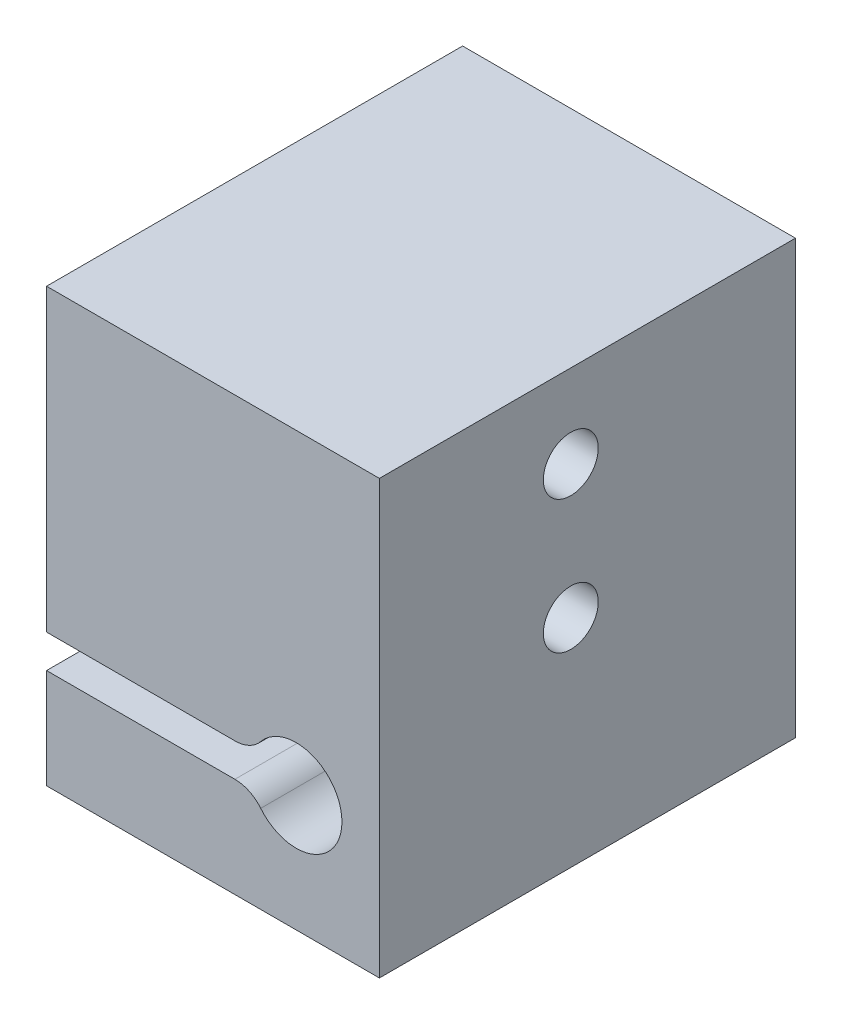
ISO-10303-21;
HEADER;
FILE_DESCRIPTION(('STEP AP214'),'2;1');
FILE_NAME('part.step','',(''),(''),'','','');
FILE_SCHEMA(('AUTOMOTIVE_DESIGN { 1 0 10303 214 1 1 1 1 }'));
ENDSEC;
DATA;
#1=APPLICATION_CONTEXT('core data for automotive mechanical design processes');
#2=APPLICATION_PROTOCOL_DEFINITION('international standard','automotive_design',2000,#1);
#3=PRODUCT_CONTEXT('',#1,'mechanical');
#4=PRODUCT('Part','Part','',(#3));
#5=PRODUCT_RELATED_PRODUCT_CATEGORY('part','',(#4));
#6=PRODUCT_DEFINITION_FORMATION('','',#4);
#7=PRODUCT_DEFINITION_CONTEXT('part definition',#1,'design');
#8=PRODUCT_DEFINITION('design','',#6,#7);
#9=PRODUCT_DEFINITION_SHAPE('','',#8);
#10=(LENGTH_UNIT() NAMED_UNIT(*) SI_UNIT(.MILLI.,.METRE.));
#11=(NAMED_UNIT(*) PLANE_ANGLE_UNIT() SI_UNIT($,.RADIAN.));
#12=(NAMED_UNIT(*) SI_UNIT($,.STERADIAN.) SOLID_ANGLE_UNIT());
#13=UNCERTAINTY_MEASURE_WITH_UNIT(LENGTH_MEASURE(1.E-05),#10,'distance_accuracy_value','');
#14=(GEOMETRIC_REPRESENTATION_CONTEXT(3) GLOBAL_UNCERTAINTY_ASSIGNED_CONTEXT((#13)) GLOBAL_UNIT_ASSIGNED_CONTEXT((#10,
#11,#12)) REPRESENTATION_CONTEXT('',''));
#15=CARTESIAN_POINT('',(0.,0.,0.));
#16=DIRECTION('',(0.,0.,1.));
#17=DIRECTION('',(1.,0.,0.));
#18=AXIS2_PLACEMENT_3D('',#15,#16,#17);
#19=CARTESIAN_POINT('',(10.,12.5,0.));
#20=DIRECTION('',(0.,0.,1.));
#21=DIRECTION('',(1.,0.,0.));
#22=AXIS2_PLACEMENT_3D('',#19,#20,#21);
#23=PLANE('',#22);
#24=CARTESIAN_POINT('',(15.0000002235174,7.00000010430813,0.));
#25=DIRECTION('',(0.,0.,1.));
#26=DIRECTION('',(1.,0.,0.));
#27=AXIS2_PLACEMENT_3D('',#24,#25,#26);
#28=CIRCLE('',#27,1.25);
#29=CARTESIAN_POINT('',(13.7500002235174,7.00000010430813,0.));
#30=VERTEX_POINT('',#29);
#31=EDGE_CURVE('E211',#30,#30,#28,.T.);
#32=ORIENTED_EDGE('',*,*,#31,.T.);
#33=EDGE_LOOP('',(#32));
#34=FACE_BOUND('',#33,.T.);
#35=DIRECTION('',(0.,-1.,0.));
#36=VECTOR('',#35,1.);
#37=CARTESIAN_POINT('',(0.,25.,0.));
#38=LINE('',#37,#36);
#39=CARTESIAN_POINT('',(0.,26.,0.));
#40=VERTEX_POINT('',#39);
#41=CARTESIAN_POINT('',(0.,0.,0.));
#42=VERTEX_POINT('',#41);
#43=EDGE_CURVE('E10',#40,#42,#38,.T.);
#44=ORIENTED_EDGE('',*,*,#43,.F.);
#45=DIRECTION('',(-1.,0.,0.));
#46=VECTOR('',#45,1.);
#47=CARTESIAN_POINT('',(20.,26.,0.));
#48=LINE('',#47,#46);
#49=CARTESIAN_POINT('',(20.,26.,0.));
#50=VERTEX_POINT('',#49);
#51=EDGE_CURVE('E199',#50,#40,#48,.T.);
#52=ORIENTED_EDGE('',*,*,#51,.F.);
#53=DIRECTION('',(0.,1.,0.));
#54=VECTOR('',#53,1.);
#55=CARTESIAN_POINT('',(20.,0.,0.));
#56=LINE('',#55,#54);
#57=CARTESIAN_POINT('',(20.,0.,0.));
#58=VERTEX_POINT('',#57);
#59=EDGE_CURVE('E236',#58,#50,#56,.T.);
#60=ORIENTED_EDGE('',*,*,#59,.F.);
#61=DIRECTION('',(1.,0.,0.));
#62=VECTOR('',#61,1.);
#63=CARTESIAN_POINT('',(0.,0.,0.));
#64=LINE('',#63,#62);
#65=EDGE_CURVE('E235',#42,#58,#64,.T.);
#66=ORIENTED_EDGE('',*,*,#65,.F.);
#67=EDGE_LOOP('',(#44,#52,#60,#66));
#68=FACE_BOUND('',#67,.T.);
#69=ADVANCED_FACE('F16',(#34,#68),#23,.F.);
#70=CARTESIAN_POINT('',(0.,25.,0.));
#71=DIRECTION('',(-1.,0.,0.));
#72=DIRECTION('',(0.,0.,1.));
#73=AXIS2_PLACEMENT_3D('',#70,#71,#72);
#74=PLANE('',#73);
#75=CARTESIAN_POINT('',(0.,21.,13.5));
#76=DIRECTION('',(1.,0.,0.));
#77=DIRECTION('',(0.,-1.,0.));
#78=AXIS2_PLACEMENT_3D('',#75,#76,#77);
#79=CIRCLE('',#78,1.65);
#80=CARTESIAN_POINT('',(0.,22.65,13.5));
#81=VERTEX_POINT('',#80);
#82=EDGE_CURVE('E227',#81,#81,#79,.T.);
#83=ORIENTED_EDGE('',*,*,#82,.T.);
#84=EDGE_LOOP('',(#83));
#85=FACE_BOUND('',#84,.T.);
#86=CARTESIAN_POINT('',(0.,13.0000001192093,13.5));
#87=DIRECTION('',(1.,0.,0.));
#88=DIRECTION('',(0.,-1.,0.));
#89=AXIS2_PLACEMENT_3D('',#86,#87,#88);
#90=CIRCLE('',#89,1.65);
#91=CARTESIAN_POINT('',(0.,14.6500001192093,13.5));
#92=VERTEX_POINT('',#91);
#93=EDGE_CURVE('E273',#92,#92,#90,.T.);
#94=ORIENTED_EDGE('',*,*,#93,.T.);
#95=EDGE_LOOP('',(#94));
#96=FACE_BOUND('',#95,.T.);
#97=DIRECTION('',(0.,0.,1.));
#98=VECTOR('',#97,1.);
#99=CARTESIAN_POINT('',(0.,8.00000011920929,12.5));
#100=LINE('',#99,#98);
#101=CARTESIAN_POINT('',(0.,8.00000011920929,9.5));
#102=VERTEX_POINT('',#101);
#103=CARTESIAN_POINT('',(0.,8.00000011920929,25.));
#104=VERTEX_POINT('',#103);
#105=EDGE_CURVE('E20',#102,#104,#100,.T.);
#106=ORIENTED_EDGE('',*,*,#105,.T.);
#107=DIRECTION('',(0.,1.,0.));
#108=VECTOR('',#107,1.);
#109=CARTESIAN_POINT('',(0.,25.,25.));
#110=LINE('',#109,#108);
#111=CARTESIAN_POINT('',(0.,26.,25.));
#112=VERTEX_POINT('',#111);
#113=EDGE_CURVE('E208',#104,#112,#110,.T.);
#114=ORIENTED_EDGE('',*,*,#113,.T.);
#115=DIRECTION('',(0.,0.,1.));
#116=VECTOR('',#115,1.);
#117=CARTESIAN_POINT('',(0.,26.,0.));
#118=LINE('',#117,#116);
#119=EDGE_CURVE('E196',#40,#112,#118,.T.);
#120=ORIENTED_EDGE('',*,*,#119,.F.);
#121=ORIENTED_EDGE('',*,*,#43,.T.);
#122=DIRECTION('',(0.,0.,1.));
#123=VECTOR('',#122,1.);
#124=CARTESIAN_POINT('',(0.,0.,0.));
#125=LINE('',#124,#123);
#126=CARTESIAN_POINT('',(0.,0.,25.));
#127=VERTEX_POINT('',#126);
#128=EDGE_CURVE('E27',#42,#127,#125,.T.);
#129=ORIENTED_EDGE('',*,*,#128,.T.);
#130=DIRECTION('',(0.,-1.,0.));
#131=VECTOR('',#130,1.);
#132=CARTESIAN_POINT('',(0.,25.,25.));
#133=LINE('',#132,#131);
#134=CARTESIAN_POINT('',(0.,6.00000008940697,25.));
#135=VERTEX_POINT('',#134);
#136=EDGE_CURVE('E160',#135,#127,#133,.T.);
#137=ORIENTED_EDGE('',*,*,#136,.F.);
#138=DIRECTION('',(0.,0.,-1.));
#139=VECTOR('',#138,1.);
#140=CARTESIAN_POINT('',(0.,6.00000008940697,12.5));
#141=LINE('',#140,#139);
#142=CARTESIAN_POINT('',(0.,6.00000008940697,9.5));
#143=VERTEX_POINT('',#142);
#144=EDGE_CURVE('E154',#135,#143,#141,.T.);
#145=ORIENTED_EDGE('',*,*,#144,.T.);
#146=DIRECTION('',(0.,1.,0.));
#147=VECTOR('',#146,1.);
#148=CARTESIAN_POINT('',(0.,16.0000000521541,9.5));
#149=LINE('',#148,#147);
#150=EDGE_CURVE('E260',#143,#102,#149,.T.);
#151=ORIENTED_EDGE('',*,*,#150,.T.);
#152=EDGE_LOOP('',(#106,#114,#120,#121,#129,#137,#145,#151));
#153=FACE_BOUND('',#152,.T.);
#154=ADVANCED_FACE('F308',(#85,#96,#153),#74,.T.);
#155=CARTESIAN_POINT('',(0.,0.,0.));
#156=DIRECTION('',(0.,-1.,0.));
#157=DIRECTION('',(0.,0.,-1.));
#158=AXIS2_PLACEMENT_3D('',#155,#156,#157);
#159=PLANE('',#158);
#160=ORIENTED_EDGE('',*,*,#65,.T.);
#161=DIRECTION('',(0.,0.,1.));
#162=VECTOR('',#161,1.);
#163=CARTESIAN_POINT('',(20.,0.,0.));
#164=LINE('',#163,#162);
#165=CARTESIAN_POINT('',(20.,0.,25.));
#166=VERTEX_POINT('',#165);
#167=EDGE_CURVE('E232',#58,#166,#164,.T.);
#168=ORIENTED_EDGE('',*,*,#167,.T.);
#169=DIRECTION('',(1.,0.,0.));
#170=VECTOR('',#169,1.);
#171=CARTESIAN_POINT('',(0.,0.,25.));
#172=LINE('',#171,#170);
#173=EDGE_CURVE('E231',#127,#166,#172,.T.);
#174=ORIENTED_EDGE('',*,*,#173,.F.);
#175=ORIENTED_EDGE('',*,*,#128,.F.);
#176=EDGE_LOOP('',(#160,#168,#174,#175));
#177=FACE_BOUND('',#176,.T.);
#178=ADVANCED_FACE('F327',(#177),#159,.T.);
#179=CARTESIAN_POINT('',(20.,0.,0.));
#180=DIRECTION('',(1.,0.,0.));
#181=DIRECTION('',(0.,1.,0.));
#182=AXIS2_PLACEMENT_3D('',#179,#180,#181);
#183=PLANE('',#182);
#184=CARTESIAN_POINT('',(20.,21.,13.5));
#185=DIRECTION('',(-1.,0.,0.));
#186=DIRECTION('',(0.,-1.,0.));
#187=AXIS2_PLACEMENT_3D('',#184,#185,#186);
#188=CIRCLE('',#187,1.65);
#189=CARTESIAN_POINT('',(20.,22.65,13.5));
#190=VERTEX_POINT('',#189);
#191=EDGE_CURVE('E101',#190,#190,#188,.T.);
#192=ORIENTED_EDGE('',*,*,#191,.T.);
#193=EDGE_LOOP('',(#192));
#194=FACE_BOUND('',#193,.T.);
#195=CARTESIAN_POINT('',(20.,13.0000001192093,13.5));
#196=DIRECTION('',(-1.,0.,0.));
#197=DIRECTION('',(0.,-1.,0.));
#198=AXIS2_PLACEMENT_3D('',#195,#196,#197);
#199=CIRCLE('',#198,1.65);
#200=CARTESIAN_POINT('',(20.,14.6500001192093,13.5));
#201=VERTEX_POINT('',#200);
#202=EDGE_CURVE('E191',#201,#201,#199,.T.);
#203=ORIENTED_EDGE('',*,*,#202,.T.);
#204=EDGE_LOOP('',(#203));
#205=FACE_BOUND('',#204,.T.);
#206=ORIENTED_EDGE('',*,*,#59,.T.);
#207=DIRECTION('',(0.,0.,-1.));
#208=VECTOR('',#207,1.);
#209=CARTESIAN_POINT('',(20.,26.,0.));
#210=LINE('',#209,#208);
#211=CARTESIAN_POINT('',(20.,26.,25.));
#212=VERTEX_POINT('',#211);
#213=EDGE_CURVE('E178',#212,#50,#210,.T.);
#214=ORIENTED_EDGE('',*,*,#213,.F.);
#215=DIRECTION('',(0.,1.,0.));
#216=VECTOR('',#215,1.);
#217=CARTESIAN_POINT('',(20.,0.,25.));
#218=LINE('',#217,#216);
#219=EDGE_CURVE('E237',#166,#212,#218,.T.);
#220=ORIENTED_EDGE('',*,*,#219,.F.);
#221=ORIENTED_EDGE('',*,*,#167,.F.);
#222=EDGE_LOOP('',(#206,#214,#220,#221));
#223=FACE_BOUND('',#222,.T.);
#224=ADVANCED_FACE('F324',(#194,#205,#223),#183,.T.);
#225=CARTESIAN_POINT('',(0.,8.00000011920929,25.));
#226=DIRECTION('',(0.,1.,0.));
#227=DIRECTION('',(1.,0.,0.));
#228=AXIS2_PLACEMENT_3D('',#225,#226,#227);
#229=PLANE('',#228);
#230=DIRECTION('',(0.,0.,-1.));
#231=VECTOR('',#230,1.);
#232=CARTESIAN_POINT('',(11.317270269992,8.00000011920929,17.25));
#233=LINE('',#232,#231);
#234=CARTESIAN_POINT('',(11.317270269992,8.00000011920929,25.));
#235=VERTEX_POINT('',#234);
#236=CARTESIAN_POINT('',(11.317270269992,8.00000011920929,9.5));
#237=VERTEX_POINT('',#236);
#238=EDGE_CURVE('E258',#235,#237,#233,.T.);
#239=ORIENTED_EDGE('',*,*,#238,.F.);
#240=DIRECTION('',(1.,0.,0.));
#241=VECTOR('',#240,1.);
#242=CARTESIAN_POINT('',(5.,8.00000011920929,25.));
#243=LINE('',#242,#241);
#244=EDGE_CURVE('E204',#104,#235,#243,.T.);
#245=ORIENTED_EDGE('',*,*,#244,.F.);
#246=ORIENTED_EDGE('',*,*,#105,.F.);
#247=DIRECTION('',(1.,0.,0.));
#248=VECTOR('',#247,1.);
#249=CARTESIAN_POINT('',(15.0000002235174,8.00000011920929,9.5));
#250=LINE('',#249,#248);
#251=EDGE_CURVE('E216',#102,#237,#250,.T.);
#252=ORIENTED_EDGE('',*,*,#251,.T.);
#253=EDGE_LOOP('',(#239,#245,#246,#252));
#254=FACE_BOUND('',#253,.T.);
#255=ADVANCED_FACE('F366',(#254),#229,.F.);
#256=CARTESIAN_POINT('',(7.50000011175871,7.00000010430813,9.5));
#257=DIRECTION('',(0.,0.,-1.));
#258=DIRECTION('',(0.,-1.,0.));
#259=AXIS2_PLACEMENT_3D('',#256,#257,#258);
#260=PLANE('',#259);
#261=CARTESIAN_POINT('',(15.0000002235174,7.00000010430813,9.5));
#262=DIRECTION('',(0.,0.,-1.));
#263=DIRECTION('',(1.,0.,0.));
#264=AXIS2_PLACEMENT_3D('',#261,#262,#263);
#265=CIRCLE('',#264,1.25);
#266=CARTESIAN_POINT('',(13.7500002235174,7.00000010430813,9.5));
#267=VERTEX_POINT('',#266);
#268=EDGE_CURVE('E223',#267,#267,#265,.T.);
#269=ORIENTED_EDGE('',*,*,#268,.T.);
#270=EDGE_LOOP('',(#269));
#271=FACE_BOUND('',#270,.T.);
#272=ORIENTED_EDGE('',*,*,#251,.F.);
#273=ORIENTED_EDGE('',*,*,#150,.F.);
#274=DIRECTION('',(-1.,0.,0.));
#275=VECTOR('',#274,1.);
#276=CARTESIAN_POINT('',(0.,6.00000008940697,9.5));
#277=LINE('',#276,#275);
#278=CARTESIAN_POINT('',(11.317270269992,6.00000008940697,9.5));
#279=VERTEX_POINT('',#278);
#280=EDGE_CURVE('E209',#279,#143,#277,.T.);
#281=ORIENTED_EDGE('',*,*,#280,.F.);
#282=CARTESIAN_POINT('',(11.317270269992,4.00000008940697,9.5));
#283=DIRECTION('',(0.,0.,1.));
#284=DIRECTION('',(0.429197535812179,0.903210648327816,0.));
#285=AXIS2_PLACEMENT_3D('',#282,#283,#284);
#286=CIRCLE('',#285,2.);
#287=CARTESIAN_POINT('',(12.8678934083185,5.26315799041798,9.5));
#288=VERTEX_POINT('',#287);
#289=EDGE_CURVE('E169',#288,#279,#286,.T.);
#290=ORIENTED_EDGE('',*,*,#289,.F.);
#291=CARTESIAN_POINT('',(15.0000002235174,7.00000010430813,9.5));
#292=DIRECTION('',(0.,0.,-1.));
#293=DIRECTION('',(1.,0.,0.));
#294=AXIS2_PLACEMENT_3D('',#291,#292,#293);
#295=CIRCLE('',#294,2.75);
#296=CARTESIAN_POINT('',(12.8678934083185,8.73684221819827,9.5));
#297=VERTEX_POINT('',#296);
#298=EDGE_CURVE('E161',#297,#288,#295,.T.);
#299=ORIENTED_EDGE('',*,*,#298,.F.);
#300=CARTESIAN_POINT('',(11.317270269992,10.0000001192093,9.5));
#301=DIRECTION('',(0.,0.,1.));
#302=DIRECTION('',(0.429197535812178,-0.903210648327816,0.));
#303=AXIS2_PLACEMENT_3D('',#300,#301,#302);
#304=CIRCLE('',#303,2.);
#305=EDGE_CURVE('E277',#237,#297,#304,.T.);
#306=ORIENTED_EDGE('',*,*,#305,.F.);
#307=EDGE_LOOP('',(#272,#273,#281,#290,#299,#306));
#308=FACE_BOUND('',#307,.T.);
#309=ADVANCED_FACE('F251',(#271,#308),#260,.F.);
#310=CARTESIAN_POINT('',(15.0000002235174,6.00000008940697,25.));
#311=DIRECTION('',(0.,-1.,0.));
#312=DIRECTION('',(0.,0.,-1.));
#313=AXIS2_PLACEMENT_3D('',#310,#311,#312);
#314=PLANE('',#313);
#315=DIRECTION('',(0.,0.,1.));
#316=VECTOR('',#315,1.);
#317=CARTESIAN_POINT('',(11.317270269992,6.00000008940697,17.25));
#318=LINE('',#317,#316);
#319=CARTESIAN_POINT('',(11.317270269992,6.00000008940697,25.));
#320=VERTEX_POINT('',#319);
#321=EDGE_CURVE('E151',#279,#320,#318,.T.);
#322=ORIENTED_EDGE('',*,*,#321,.F.);
#323=ORIENTED_EDGE('',*,*,#280,.T.);
#324=ORIENTED_EDGE('',*,*,#144,.F.);
#325=DIRECTION('',(-1.,0.,0.));
#326=VECTOR('',#325,1.);
#327=CARTESIAN_POINT('',(12.5000001117587,6.00000008940697,25.));
#328=LINE('',#327,#326);
#329=EDGE_CURVE('E148',#320,#135,#328,.T.);
#330=ORIENTED_EDGE('',*,*,#329,.F.);
#331=EDGE_LOOP('',(#322,#323,#324,#330));
#332=FACE_BOUND('',#331,.T.);
#333=ADVANCED_FACE('F18',(#332),#314,.F.);
#334=CARTESIAN_POINT('',(15.0000002235174,7.00000010430813,1.75));
#335=DIRECTION('',(0.,0.,-1.));
#336=DIRECTION('',(1.,0.,0.));
#337=AXIS2_PLACEMENT_3D('',#334,#335,#336);
#338=CYLINDRICAL_SURFACE('',#337,1.25);
#339=ORIENTED_EDGE('',*,*,#268,.F.);
#340=DIRECTION('',(0.,0.,-1.));
#341=VECTOR('',#340,1.);
#342=CARTESIAN_POINT('',(13.7500002235174,7.00000010430813,1.75));
#343=LINE('',#342,#341);
#344=EDGE_CURVE('E112',#267,#30,#343,.T.);
#345=ORIENTED_EDGE('',*,*,#344,.T.);
#346=ORIENTED_EDGE('',*,*,#31,.F.);
#347=ORIENTED_EDGE('',*,*,#344,.F.);
#348=EDGE_LOOP('',(#339,#345,#346,#347));
#349=FACE_BOUND('',#348,.T.);
#350=ADVANCED_FACE('F341',(#349),#338,.F.);
#351=CARTESIAN_POINT('',(10.,21.,13.5));
#352=DIRECTION('',(1.,0.,0.));
#353=DIRECTION('',(0.,-1.,0.));
#354=AXIS2_PLACEMENT_3D('',#351,#352,#353);
#355=CYLINDRICAL_SURFACE('',#354,1.65);
#356=ORIENTED_EDGE('',*,*,#82,.F.);
#357=DIRECTION('',(1.,0.,0.));
#358=VECTOR('',#357,1.);
#359=CARTESIAN_POINT('',(10.,22.65,13.5));
#360=LINE('',#359,#358);
#361=EDGE_CURVE('E278',#81,#190,#360,.T.);
#362=ORIENTED_EDGE('',*,*,#361,.T.);
#363=ORIENTED_EDGE('',*,*,#191,.F.);
#364=ORIENTED_EDGE('',*,*,#361,.F.);
#365=EDGE_LOOP('',(#356,#362,#363,#364));
#366=FACE_BOUND('',#365,.T.);
#367=ADVANCED_FACE('F343',(#366),#355,.F.);
#368=CARTESIAN_POINT('',(10.,13.0000001192093,13.5));
#369=DIRECTION('',(1.,0.,0.));
#370=DIRECTION('',(0.,-1.,0.));
#371=AXIS2_PLACEMENT_3D('',#368,#369,#370);
#372=CYLINDRICAL_SURFACE('',#371,1.65);
#373=ORIENTED_EDGE('',*,*,#93,.F.);
#374=DIRECTION('',(1.,0.,0.));
#375=VECTOR('',#374,1.);
#376=CARTESIAN_POINT('',(10.,14.6500001192093,13.5));
#377=LINE('',#376,#375);
#378=EDGE_CURVE('E269',#92,#201,#377,.T.);
#379=ORIENTED_EDGE('',*,*,#378,.T.);
#380=ORIENTED_EDGE('',*,*,#202,.F.);
#381=ORIENTED_EDGE('',*,*,#378,.F.);
#382=EDGE_LOOP('',(#373,#379,#380,#381));
#383=FACE_BOUND('',#382,.T.);
#384=ADVANCED_FACE('F350',(#383),#372,.F.);
#385=CARTESIAN_POINT('',(11.317270269992,10.0000001192093,17.25));
#386=DIRECTION('',(0.,0.,1.));
#387=DIRECTION('',(0.429197535812178,-0.903210648327816,0.));
#388=AXIS2_PLACEMENT_3D('',#385,#386,#387);
#389=CYLINDRICAL_SURFACE('',#388,2.);
#390=CARTESIAN_POINT('',(11.317270269992,10.0000001192093,25.));
#391=DIRECTION('',(0.,0.,-1.));
#392=DIRECTION('',(0.429197535812178,-0.903210648327816,0.));
#393=AXIS2_PLACEMENT_3D('',#390,#391,#392);
#394=CIRCLE('',#393,2.);
#395=CARTESIAN_POINT('',(12.8678934083185,8.73684221819827,25.));
#396=VERTEX_POINT('',#395);
#397=EDGE_CURVE('E207',#396,#235,#394,.T.);
#398=ORIENTED_EDGE('',*,*,#397,.T.);
#399=ORIENTED_EDGE('',*,*,#238,.T.);
#400=ORIENTED_EDGE('',*,*,#305,.T.);
#401=DIRECTION('',(0.,0.,1.));
#402=VECTOR('',#401,1.);
#403=CARTESIAN_POINT('',(12.8678934083185,8.73684221819827,17.25));
#404=LINE('',#403,#402);
#405=EDGE_CURVE('E195',#297,#396,#404,.T.);
#406=ORIENTED_EDGE('',*,*,#405,.T.);
#407=EDGE_LOOP('',(#398,#399,#400,#406));
#408=FACE_BOUND('',#407,.T.);
#409=ADVANCED_FACE('F385',(#408),#389,.T.);
#410=CARTESIAN_POINT('',(10.,12.5,25.));
#411=DIRECTION('',(0.,0.,1.));
#412=DIRECTION('',(1.,0.,0.));
#413=AXIS2_PLACEMENT_3D('',#410,#411,#412);
#414=PLANE('',#413);
#415=CARTESIAN_POINT('',(11.317270269992,4.00000008940697,25.));
#416=DIRECTION('',(0.,0.,-1.));
#417=DIRECTION('',(0.429197535812179,0.903210648327816,0.));
#418=AXIS2_PLACEMENT_3D('',#415,#416,#417);
#419=CIRCLE('',#418,2.);
#420=CARTESIAN_POINT('',(12.8678934083185,5.26315799041798,25.));
#421=VERTEX_POINT('',#420);
#422=EDGE_CURVE('E167',#320,#421,#419,.T.);
#423=ORIENTED_EDGE('',*,*,#422,.F.);
#424=ORIENTED_EDGE('',*,*,#329,.T.);
#425=ORIENTED_EDGE('',*,*,#136,.T.);
#426=ORIENTED_EDGE('',*,*,#173,.T.);
#427=ORIENTED_EDGE('',*,*,#219,.T.);
#428=DIRECTION('',(1.,0.,0.));
#429=VECTOR('',#428,1.);
#430=CARTESIAN_POINT('',(20.,26.,25.));
#431=LINE('',#430,#429);
#432=EDGE_CURVE('E187',#112,#212,#431,.T.);
#433=ORIENTED_EDGE('',*,*,#432,.F.);
#434=ORIENTED_EDGE('',*,*,#113,.F.);
#435=ORIENTED_EDGE('',*,*,#244,.T.);
#436=ORIENTED_EDGE('',*,*,#397,.F.);
#437=CARTESIAN_POINT('',(15.0000002235174,7.00000010430813,25.));
#438=DIRECTION('',(0.,0.,-1.));
#439=DIRECTION('',(1.,0.,0.));
#440=AXIS2_PLACEMENT_3D('',#437,#438,#439);
#441=CIRCLE('',#440,2.75);
#442=EDGE_CURVE('E171',#396,#421,#441,.T.);
#443=ORIENTED_EDGE('',*,*,#442,.T.);
#444=EDGE_LOOP('',(#423,#424,#425,#426,#427,#433,#434,#435,#436,#443));
#445=FACE_BOUND('',#444,.T.);
#446=ADVANCED_FACE('F173',(#445),#414,.T.);
#447=CARTESIAN_POINT('',(15.0000002235174,7.00000010430813,17.25));
#448=DIRECTION('',(0.,0.,-1.));
#449=DIRECTION('',(1.,0.,0.));
#450=AXIS2_PLACEMENT_3D('',#447,#448,#449);
#451=CYLINDRICAL_SURFACE('',#450,2.75);
#452=DIRECTION('',(0.,0.,-1.));
#453=VECTOR('',#452,1.);
#454=CARTESIAN_POINT('',(12.8678934083185,5.26315799041798,17.25));
#455=LINE('',#454,#453);
#456=EDGE_CURVE('E177',#421,#288,#455,.T.);
#457=ORIENTED_EDGE('',*,*,#456,.F.);
#458=ORIENTED_EDGE('',*,*,#442,.F.);
#459=ORIENTED_EDGE('',*,*,#405,.F.);
#460=ORIENTED_EDGE('',*,*,#298,.T.);
#461=EDGE_LOOP('',(#457,#458,#459,#460));
#462=FACE_BOUND('',#461,.T.);
#463=ADVANCED_FACE('F247',(#462),#451,.F.);
#464=CARTESIAN_POINT('',(11.317270269992,4.00000008940697,17.25));
#465=DIRECTION('',(0.,0.,-1.));
#466=DIRECTION('',(0.429197535812179,0.903210648327816,0.));
#467=AXIS2_PLACEMENT_3D('',#464,#465,#466);
#468=CYLINDRICAL_SURFACE('',#467,2.);
#469=ORIENTED_EDGE('',*,*,#422,.T.);
#470=ORIENTED_EDGE('',*,*,#456,.T.);
#471=ORIENTED_EDGE('',*,*,#289,.T.);
#472=ORIENTED_EDGE('',*,*,#321,.T.);
#473=EDGE_LOOP('',(#469,#470,#471,#472));
#474=FACE_BOUND('',#473,.T.);
#475=ADVANCED_FACE('F165',(#474),#468,.T.);
#476=CARTESIAN_POINT('',(20.,26.,0.));
#477=DIRECTION('',(0.,1.,0.));
#478=DIRECTION('',(1.,0.,0.));
#479=AXIS2_PLACEMENT_3D('',#476,#477,#478);
#480=PLANE('',#479);
#481=ORIENTED_EDGE('',*,*,#51,.T.);
#482=ORIENTED_EDGE('',*,*,#119,.T.);
#483=ORIENTED_EDGE('',*,*,#432,.T.);
#484=ORIENTED_EDGE('',*,*,#213,.T.);
#485=EDGE_LOOP('',(#481,#482,#483,#484));
#486=FACE_BOUND('',#485,.T.);
#487=ADVANCED_FACE('F315',(#486),#480,.T.);
#488=CLOSED_SHELL('',(#69,#154,#178,#224,#255,#309,#333,#350,#367,#384,#409,#446,#463,#475,#487));
#489=MANIFOLD_SOLID_BREP('B1',#488);
#490=ADVANCED_BREP_SHAPE_REPRESENTATION('',(#18,#489),#14);
#491=SHAPE_DEFINITION_REPRESENTATION(#9,#490);
ENDSEC;
END-ISO-10303-21;
